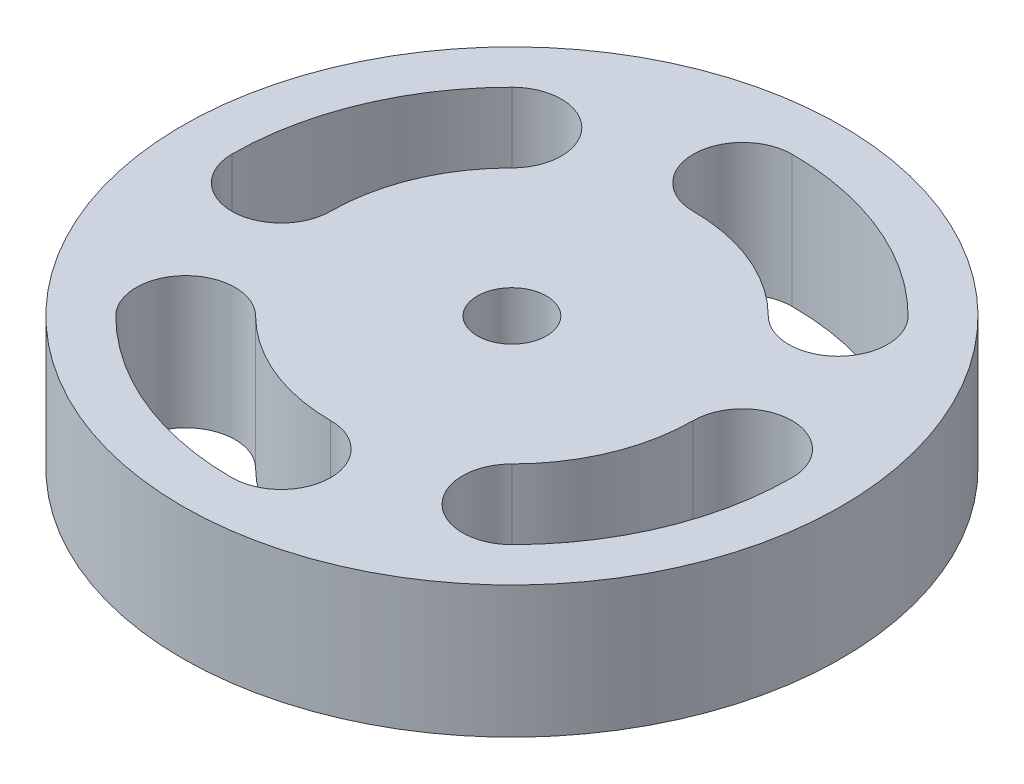
ISO-10303-21;
HEADER;
FILE_DESCRIPTION(('STEP AP214'),'2;1');
FILE_NAME('part.step','',(''),(''),'','','');
FILE_SCHEMA(('AUTOMOTIVE_DESIGN { 1 0 10303 214 1 1 1 1 }'));
ENDSEC;
DATA;
#1=APPLICATION_CONTEXT('core data for automotive mechanical design processes');
#2=APPLICATION_PROTOCOL_DEFINITION('international standard','automotive_design',2000,#1);
#3=PRODUCT_CONTEXT('',#1,'mechanical');
#4=PRODUCT('Part','Part','',(#3));
#5=PRODUCT_RELATED_PRODUCT_CATEGORY('part','',(#4));
#6=PRODUCT_DEFINITION_FORMATION('','',#4);
#7=PRODUCT_DEFINITION_CONTEXT('part definition',#1,'design');
#8=PRODUCT_DEFINITION('design','',#6,#7);
#9=PRODUCT_DEFINITION_SHAPE('','',#8);
#10=(LENGTH_UNIT() NAMED_UNIT(*) SI_UNIT(.MILLI.,.METRE.));
#11=(NAMED_UNIT(*) PLANE_ANGLE_UNIT() SI_UNIT($,.RADIAN.));
#12=(NAMED_UNIT(*) SI_UNIT($,.STERADIAN.) SOLID_ANGLE_UNIT());
#13=UNCERTAINTY_MEASURE_WITH_UNIT(LENGTH_MEASURE(1.E-05),#10,'distance_accuracy_value','');
#14=(GEOMETRIC_REPRESENTATION_CONTEXT(3) GLOBAL_UNCERTAINTY_ASSIGNED_CONTEXT((#13)) GLOBAL_UNIT_ASSIGNED_CONTEXT((#10,
#11,#12)) REPRESENTATION_CONTEXT('',''));
#15=CARTESIAN_POINT('',(0.,0.,0.));
#16=DIRECTION('',(0.,0.,1.));
#17=DIRECTION('',(1.,0.,0.));
#18=AXIS2_PLACEMENT_3D('',#15,#16,#17);
#19=CARTESIAN_POINT('',(0.,20.,0.));
#20=DIRECTION('',(0.,-1.,0.));
#21=DIRECTION('',(0.,0.,-1.));
#22=AXIS2_PLACEMENT_3D('',#19,#20,#21);
#23=CYLINDRICAL_SURFACE('',#22,50.);
#24=CARTESIAN_POINT('',(0.,20.,0.));
#25=DIRECTION('',(0.,1.,0.));
#26=DIRECTION('',(0.,0.,1.));
#27=AXIS2_PLACEMENT_3D('',#24,#25,#26);
#28=CIRCLE('',#27,50.);
#29=CARTESIAN_POINT('',(0.,20.,50.));
#30=VERTEX_POINT('',#29);
#31=EDGE_CURVE('E11',#30,#30,#28,.T.);
#32=ORIENTED_EDGE('',*,*,#31,.F.);
#33=EDGE_LOOP('',(#32));
#34=FACE_BOUND('',#33,.T.);
#35=CARTESIAN_POINT('',(0.,0.,0.));
#36=DIRECTION('',(0.,1.,0.));
#37=DIRECTION('',(0.,0.,1.));
#38=AXIS2_PLACEMENT_3D('',#35,#36,#37);
#39=CIRCLE('',#38,50.);
#40=CARTESIAN_POINT('',(0.,0.,50.));
#41=VERTEX_POINT('',#40);
#42=EDGE_CURVE('E48',#41,#41,#39,.T.);
#43=ORIENTED_EDGE('',*,*,#42,.T.);
#44=EDGE_LOOP('',(#43));
#45=FACE_BOUND('',#44,.T.);
#46=ADVANCED_FACE('F45',(#34,#45),#23,.T.);
#47=CARTESIAN_POINT('',(0.,20.,0.));
#48=DIRECTION('',(0.,1.,0.));
#49=DIRECTION('',(0.,0.,1.));
#50=AXIS2_PLACEMENT_3D('',#47,#48,#49);
#51=PLANE('',#50);
#52=CARTESIAN_POINT('',(0.,20.,-35.));
#53=DIRECTION('',(0.,1.,0.));
#54=DIRECTION('',(0.,0.,1.));
#55=AXIS2_PLACEMENT_3D('',#52,#53,#54);
#56=CIRCLE('',#55,7.5);
#57=CARTESIAN_POINT('',(0.,20.,-42.5));
#58=VERTEX_POINT('',#57);
#59=CARTESIAN_POINT('',(0.,20.,-27.5));
#60=VERTEX_POINT('',#59);
#61=EDGE_CURVE('E60',#58,#60,#56,.T.);
#62=ORIENTED_EDGE('',*,*,#61,.F.);
#63=CARTESIAN_POINT('',(0.,20.,0.));
#64=DIRECTION('',(0.,1.,0.));
#65=DIRECTION('',(0.,0.,1.));
#66=AXIS2_PLACEMENT_3D('',#63,#64,#65);
#67=CIRCLE('',#66,42.5);
#68=CARTESIAN_POINT('',(30.0520382004283,20.,-30.0520382004282));
#69=VERTEX_POINT('',#68);
#70=EDGE_CURVE('E263',#69,#58,#67,.T.);
#71=ORIENTED_EDGE('',*,*,#70,.F.);
#72=CARTESIAN_POINT('',(24.7487373415292,20.,-24.7487373415291));
#73=DIRECTION('',(0.,1.,0.));
#74=DIRECTION('',(0.,0.,1.));
#75=AXIS2_PLACEMENT_3D('',#72,#73,#74);
#76=CIRCLE('',#75,7.5);
#77=CARTESIAN_POINT('',(19.4454364826301,20.,-19.44543648263));
#78=VERTEX_POINT('',#77);
#79=EDGE_CURVE('E281',#78,#69,#76,.T.);
#80=ORIENTED_EDGE('',*,*,#79,.F.);
#81=CARTESIAN_POINT('',(0.,20.,0.));
#82=DIRECTION('',(0.,1.,0.));
#83=DIRECTION('',(0.,0.,1.));
#84=AXIS2_PLACEMENT_3D('',#81,#82,#83);
#85=CIRCLE('',#84,27.5);
#86=EDGE_CURVE('E277',#78,#60,#85,.T.);
#87=ORIENTED_EDGE('',*,*,#86,.T.);
#88=EDGE_LOOP('',(#62,#71,#80,#87));
#89=FACE_BOUND('',#88,.T.);
#90=CARTESIAN_POINT('',(35.,20.,1.2220184685951E-13));
#91=DIRECTION('',(0.,1.,0.));
#92=DIRECTION('',(0.,0.,1.));
#93=AXIS2_PLACEMENT_3D('',#90,#91,#92);
#94=CIRCLE('',#93,7.5);
#95=CARTESIAN_POINT('',(42.5,20.,1.48387956900833E-13));
#96=VERTEX_POINT('',#95);
#97=CARTESIAN_POINT('',(27.5,20.,0.));
#98=VERTEX_POINT('',#97);
#99=EDGE_CURVE('E68',#96,#98,#94,.T.);
#100=ORIENTED_EDGE('',*,*,#99,.F.);
#101=CARTESIAN_POINT('',(0.,20.,0.));
#102=DIRECTION('',(0.,1.,0.));
#103=DIRECTION('',(0.,0.,1.));
#104=AXIS2_PLACEMENT_3D('',#101,#102,#103);
#105=CIRCLE('',#104,42.5);
#106=CARTESIAN_POINT('',(30.0520382004281,20.,30.0520382004284));
#107=VERTEX_POINT('',#106);
#108=EDGE_CURVE('E222',#107,#96,#105,.T.);
#109=ORIENTED_EDGE('',*,*,#108,.F.);
#110=CARTESIAN_POINT('',(24.748737341529,20.,24.7487373415293));
#111=DIRECTION('',(0.,1.,0.));
#112=DIRECTION('',(0.,0.,1.));
#113=AXIS2_PLACEMENT_3D('',#110,#111,#112);
#114=CIRCLE('',#113,7.5);
#115=CARTESIAN_POINT('',(19.44543648263,20.,19.4454364826302));
#116=VERTEX_POINT('',#115);
#117=EDGE_CURVE('E241',#116,#107,#114,.T.);
#118=ORIENTED_EDGE('',*,*,#117,.F.);
#119=CARTESIAN_POINT('',(0.,20.,0.));
#120=DIRECTION('',(0.,1.,0.));
#121=DIRECTION('',(0.,0.,1.));
#122=AXIS2_PLACEMENT_3D('',#119,#120,#121);
#123=CIRCLE('',#122,27.5);
#124=EDGE_CURVE('E236',#116,#98,#123,.T.);
#125=ORIENTED_EDGE('',*,*,#124,.T.);
#126=EDGE_LOOP('',(#100,#109,#118,#125));
#127=FACE_BOUND('',#126,.T.);
#128=CARTESIAN_POINT('',(0.,20.,0.));
#129=DIRECTION('',(0.,1.,0.));
#130=DIRECTION('',(0.,0.,1.));
#131=AXIS2_PLACEMENT_3D('',#128,#129,#130);
#132=CIRCLE('',#131,42.5);
#133=CARTESIAN_POINT('',(-30.0520382004285,20.,30.052038200428));
#134=VERTEX_POINT('',#133);
#135=CARTESIAN_POINT('',(-2.44403693719019E-13,20.,42.5));
#136=VERTEX_POINT('',#135);
#137=EDGE_CURVE('E167',#134,#136,#132,.T.);
#138=ORIENTED_EDGE('',*,*,#137,.F.);
#139=CARTESIAN_POINT('',(-24.7487373415294,20.,24.748737341529));
#140=DIRECTION('',(0.,1.,0.));
#141=DIRECTION('',(0.,0.,1.));
#142=AXIS2_PLACEMENT_3D('',#139,#140,#141);
#143=CIRCLE('',#142,7.5);
#144=CARTESIAN_POINT('',(-19.4454364826302,20.,19.4454364826299));
#145=VERTEX_POINT('',#144);
#146=EDGE_CURVE('E188',#145,#134,#143,.T.);
#147=ORIENTED_EDGE('',*,*,#146,.F.);
#148=CARTESIAN_POINT('',(0.,20.,0.));
#149=DIRECTION('',(0.,1.,0.));
#150=DIRECTION('',(0.,0.,1.));
#151=AXIS2_PLACEMENT_3D('',#148,#149,#150);
#152=CIRCLE('',#151,27.5);
#153=CARTESIAN_POINT('',(-1.92031473636372E-13,20.,27.5));
#154=VERTEX_POINT('',#153);
#155=EDGE_CURVE('E192',#145,#154,#152,.T.);
#156=ORIENTED_EDGE('',*,*,#155,.T.);
#157=CARTESIAN_POINT('',(-2.44403693719019E-13,20.,35.));
#158=DIRECTION('',(0.,1.,0.));
#159=DIRECTION('',(0.,0.,1.));
#160=AXIS2_PLACEMENT_3D('',#157,#158,#159);
#161=CIRCLE('',#160,7.5);
#162=EDGE_CURVE('E201',#136,#154,#161,.T.);
#163=ORIENTED_EDGE('',*,*,#162,.F.);
#164=EDGE_LOOP('',(#138,#147,#156,#163));
#165=FACE_BOUND('',#164,.T.);
#166=CARTESIAN_POINT('',(0.,20.,0.));
#167=DIRECTION('',(0.,1.,0.));
#168=DIRECTION('',(0.,0.,1.));
#169=AXIS2_PLACEMENT_3D('',#166,#167,#168);
#170=CIRCLE('',#169,42.5);
#171=CARTESIAN_POINT('',(-30.0520382004279,20.,-30.0520382004286));
#172=VERTEX_POINT('',#171);
#173=CARTESIAN_POINT('',(-42.5,20.,-4.451638707025E-13));
#174=VERTEX_POINT('',#173);
#175=EDGE_CURVE('E211',#172,#174,#170,.T.);
#176=ORIENTED_EDGE('',*,*,#175,.F.);
#177=CARTESIAN_POINT('',(-24.7487373415289,20.,-24.7487373415295));
#178=DIRECTION('',(0.,1.,0.));
#179=DIRECTION('',(0.,0.,1.));
#180=AXIS2_PLACEMENT_3D('',#177,#178,#179);
#181=CIRCLE('',#180,7.5);
#182=CARTESIAN_POINT('',(-19.4454364826298,20.,-19.4454364826303));
#183=VERTEX_POINT('',#182);
#184=EDGE_CURVE('E303',#183,#172,#181,.T.);
#185=ORIENTED_EDGE('',*,*,#184,.F.);
#186=CARTESIAN_POINT('',(0.,20.,0.));
#187=DIRECTION('',(0.,1.,0.));
#188=DIRECTION('',(0.,0.,1.));
#189=AXIS2_PLACEMENT_3D('',#186,#187,#188);
#190=CIRCLE('',#189,27.5);
#191=CARTESIAN_POINT('',(-27.5,20.,-2.88047210454559E-13));
#192=VERTEX_POINT('',#191);
#193=EDGE_CURVE('E322',#183,#192,#190,.T.);
#194=ORIENTED_EDGE('',*,*,#193,.T.);
#195=CARTESIAN_POINT('',(-35.,20.,-3.66605540578529E-13));
#196=DIRECTION('',(0.,1.,0.));
#197=DIRECTION('',(0.,0.,1.));
#198=AXIS2_PLACEMENT_3D('',#195,#196,#197);
#199=CIRCLE('',#198,7.5);
#200=EDGE_CURVE('E318',#174,#192,#199,.T.);
#201=ORIENTED_EDGE('',*,*,#200,.F.);
#202=EDGE_LOOP('',(#176,#185,#194,#201));
#203=FACE_BOUND('',#202,.T.);
#204=CARTESIAN_POINT('',(0.,20.,0.));
#205=DIRECTION('',(0.,1.,0.));
#206=DIRECTION('',(0.,0.,1.));
#207=AXIS2_PLACEMENT_3D('',#204,#205,#206);
#208=CIRCLE('',#207,5.25);
#209=CARTESIAN_POINT('',(0.,20.,5.25));
#210=VERTEX_POINT('',#209);
#211=EDGE_CURVE('E332',#210,#210,#208,.T.);
#212=ORIENTED_EDGE('',*,*,#211,.F.);
#213=EDGE_LOOP('',(#212));
#214=FACE_BOUND('',#213,.T.);
#215=ORIENTED_EDGE('',*,*,#31,.T.);
#216=EDGE_LOOP('',(#215));
#217=FACE_BOUND('',#216,.T.);
#218=ADVANCED_FACE('F352',(#89,#127,#165,#203,#214,#217),#51,.T.);
#219=CARTESIAN_POINT('',(0.,0.,0.));
#220=DIRECTION('',(0.,1.,0.));
#221=DIRECTION('',(0.,0.,1.));
#222=AXIS2_PLACEMENT_3D('',#219,#220,#221);
#223=PLANE('',#222);
#224=CARTESIAN_POINT('',(0.,0.,0.));
#225=DIRECTION('',(0.,1.,0.));
#226=DIRECTION('',(0.,0.,1.));
#227=AXIS2_PLACEMENT_3D('',#224,#225,#226);
#228=CIRCLE('',#227,42.5);
#229=CARTESIAN_POINT('',(30.0520382004283,0.,-30.0520382004282));
#230=VERTEX_POINT('',#229);
#231=CARTESIAN_POINT('',(0.,0.,-42.5));
#232=VERTEX_POINT('',#231);
#233=EDGE_CURVE('E270',#230,#232,#228,.T.);
#234=ORIENTED_EDGE('',*,*,#233,.T.);
#235=CARTESIAN_POINT('',(0.,0.,-35.));
#236=DIRECTION('',(0.,1.,0.));
#237=DIRECTION('',(0.,0.,1.));
#238=AXIS2_PLACEMENT_3D('',#235,#236,#237);
#239=CIRCLE('',#238,7.5);
#240=CARTESIAN_POINT('',(0.,0.,-27.5));
#241=VERTEX_POINT('',#240);
#242=EDGE_CURVE('E258',#232,#241,#239,.T.);
#243=ORIENTED_EDGE('',*,*,#242,.T.);
#244=CARTESIAN_POINT('',(0.,0.,0.));
#245=DIRECTION('',(0.,1.,0.));
#246=DIRECTION('',(0.,0.,1.));
#247=AXIS2_PLACEMENT_3D('',#244,#245,#246);
#248=CIRCLE('',#247,27.5);
#249=CARTESIAN_POINT('',(19.4454364826301,0.,-19.44543648263));
#250=VERTEX_POINT('',#249);
#251=EDGE_CURVE('E262',#250,#241,#248,.T.);
#252=ORIENTED_EDGE('',*,*,#251,.F.);
#253=CARTESIAN_POINT('',(24.7487373415292,0.,-24.7487373415291));
#254=DIRECTION('',(0.,1.,0.));
#255=DIRECTION('',(0.,0.,1.));
#256=AXIS2_PLACEMENT_3D('',#253,#254,#255);
#257=CIRCLE('',#256,7.5);
#258=EDGE_CURVE('E266',#250,#230,#257,.T.);
#259=ORIENTED_EDGE('',*,*,#258,.T.);
#260=EDGE_LOOP('',(#234,#243,#252,#259));
#261=FACE_BOUND('',#260,.T.);
#262=CARTESIAN_POINT('',(0.,0.,0.));
#263=DIRECTION('',(0.,1.,0.));
#264=DIRECTION('',(0.,0.,1.));
#265=AXIS2_PLACEMENT_3D('',#262,#263,#264);
#266=CIRCLE('',#265,42.5);
#267=CARTESIAN_POINT('',(30.0520382004281,0.,30.0520382004284));
#268=VERTEX_POINT('',#267);
#269=CARTESIAN_POINT('',(42.5,0.,1.48387956900833E-13));
#270=VERTEX_POINT('',#269);
#271=EDGE_CURVE('E229',#268,#270,#266,.T.);
#272=ORIENTED_EDGE('',*,*,#271,.T.);
#273=CARTESIAN_POINT('',(35.,0.,1.2220184685951E-13));
#274=DIRECTION('',(0.,1.,0.));
#275=DIRECTION('',(0.,0.,1.));
#276=AXIS2_PLACEMENT_3D('',#273,#274,#275);
#277=CIRCLE('',#276,7.5);
#278=CARTESIAN_POINT('',(27.5,0.,0.));
#279=VERTEX_POINT('',#278);
#280=EDGE_CURVE('E217',#270,#279,#277,.T.);
#281=ORIENTED_EDGE('',*,*,#280,.T.);
#282=CARTESIAN_POINT('',(0.,0.,0.));
#283=DIRECTION('',(0.,1.,0.));
#284=DIRECTION('',(0.,0.,1.));
#285=AXIS2_PLACEMENT_3D('',#282,#283,#284);
#286=CIRCLE('',#285,27.5);
#287=CARTESIAN_POINT('',(19.44543648263,0.,19.4454364826302));
#288=VERTEX_POINT('',#287);
#289=EDGE_CURVE('E221',#288,#279,#286,.T.);
#290=ORIENTED_EDGE('',*,*,#289,.F.);
#291=CARTESIAN_POINT('',(24.748737341529,0.,24.7487373415293));
#292=DIRECTION('',(0.,1.,0.));
#293=DIRECTION('',(0.,0.,1.));
#294=AXIS2_PLACEMENT_3D('',#291,#292,#293);
#295=CIRCLE('',#294,7.5);
#296=EDGE_CURVE('E225',#288,#268,#295,.T.);
#297=ORIENTED_EDGE('',*,*,#296,.T.);
#298=EDGE_LOOP('',(#272,#281,#290,#297));
#299=FACE_BOUND('',#298,.T.);
#300=CARTESIAN_POINT('',(-24.7487373415294,0.,24.748737341529));
#301=DIRECTION('',(0.,1.,0.));
#302=DIRECTION('',(0.,0.,1.));
#303=AXIS2_PLACEMENT_3D('',#300,#301,#302);
#304=CIRCLE('',#303,7.5);
#305=CARTESIAN_POINT('',(-19.4454364826302,0.,19.4454364826299));
#306=VERTEX_POINT('',#305);
#307=CARTESIAN_POINT('',(-30.0520382004285,0.,30.052038200428));
#308=VERTEX_POINT('',#307);
#309=EDGE_CURVE('E173',#306,#308,#304,.T.);
#310=ORIENTED_EDGE('',*,*,#309,.T.);
#311=CARTESIAN_POINT('',(0.,0.,0.));
#312=DIRECTION('',(0.,1.,0.));
#313=DIRECTION('',(0.,0.,1.));
#314=AXIS2_PLACEMENT_3D('',#311,#312,#313);
#315=CIRCLE('',#314,42.5);
#316=CARTESIAN_POINT('',(-2.96775913801666E-13,0.,42.5));
#317=VERTEX_POINT('',#316);
#318=EDGE_CURVE('E164',#308,#317,#315,.T.);
#319=ORIENTED_EDGE('',*,*,#318,.T.);
#320=CARTESIAN_POINT('',(-2.44403693719019E-13,0.,35.));
#321=DIRECTION('',(0.,1.,0.));
#322=DIRECTION('',(0.,0.,1.));
#323=AXIS2_PLACEMENT_3D('',#320,#321,#322);
#324=CIRCLE('',#323,7.5);
#325=CARTESIAN_POINT('',(-1.92031473636372E-13,0.,27.5));
#326=VERTEX_POINT('',#325);
#327=EDGE_CURVE('E176',#317,#326,#324,.T.);
#328=ORIENTED_EDGE('',*,*,#327,.T.);
#329=CARTESIAN_POINT('',(0.,0.,0.));
#330=DIRECTION('',(0.,1.,0.));
#331=DIRECTION('',(0.,0.,1.));
#332=AXIS2_PLACEMENT_3D('',#329,#330,#331);
#333=CIRCLE('',#332,27.5);
#334=EDGE_CURVE('E182',#306,#326,#333,.T.);
#335=ORIENTED_EDGE('',*,*,#334,.F.);
#336=EDGE_LOOP('',(#310,#319,#328,#335));
#337=FACE_BOUND('',#336,.T.);
#338=CARTESIAN_POINT('',(-24.7487373415289,0.,-24.7487373415295));
#339=DIRECTION('',(0.,1.,0.));
#340=DIRECTION('',(0.,0.,1.));
#341=AXIS2_PLACEMENT_3D('',#338,#339,#340);
#342=CIRCLE('',#341,7.5);
#343=CARTESIAN_POINT('',(-19.4454364826298,0.,-19.4454364826303));
#344=VERTEX_POINT('',#343);
#345=CARTESIAN_POINT('',(-30.0520382004279,0.,-30.0520382004286));
#346=VERTEX_POINT('',#345);
#347=EDGE_CURVE('E311',#344,#346,#342,.T.);
#348=ORIENTED_EDGE('',*,*,#347,.T.);
#349=CARTESIAN_POINT('',(0.,0.,0.));
#350=DIRECTION('',(0.,1.,0.));
#351=DIRECTION('',(0.,0.,1.));
#352=AXIS2_PLACEMENT_3D('',#349,#350,#351);
#353=CIRCLE('',#352,42.5);
#354=CARTESIAN_POINT('',(-42.5,0.,-4.451638707025E-13));
#355=VERTEX_POINT('',#354);
#356=EDGE_CURVE('E298',#346,#355,#353,.T.);
#357=ORIENTED_EDGE('',*,*,#356,.T.);
#358=CARTESIAN_POINT('',(-35.,0.,-3.66605540578529E-13));
#359=DIRECTION('',(0.,1.,0.));
#360=DIRECTION('',(0.,0.,1.));
#361=AXIS2_PLACEMENT_3D('',#358,#359,#360);
#362=CIRCLE('',#361,7.5);
#363=CARTESIAN_POINT('',(-27.5,0.,-2.88047210454559E-13));
#364=VERTEX_POINT('',#363);
#365=EDGE_CURVE('E302',#355,#364,#362,.T.);
#366=ORIENTED_EDGE('',*,*,#365,.T.);
#367=CARTESIAN_POINT('',(0.,0.,0.));
#368=DIRECTION('',(0.,1.,0.));
#369=DIRECTION('',(0.,0.,1.));
#370=AXIS2_PLACEMENT_3D('',#367,#368,#369);
#371=CIRCLE('',#370,27.5);
#372=EDGE_CURVE('E307',#344,#364,#371,.T.);
#373=ORIENTED_EDGE('',*,*,#372,.F.);
#374=EDGE_LOOP('',(#348,#357,#366,#373));
#375=FACE_BOUND('',#374,.T.);
#376=CARTESIAN_POINT('',(0.,0.,0.));
#377=DIRECTION('',(0.,1.,0.));
#378=DIRECTION('',(0.,0.,1.));
#379=AXIS2_PLACEMENT_3D('',#376,#377,#378);
#380=CIRCLE('',#379,5.25);
#381=CARTESIAN_POINT('',(0.,0.,5.25));
#382=VERTEX_POINT('',#381);
#383=EDGE_CURVE('E342',#382,#382,#380,.T.);
#384=ORIENTED_EDGE('',*,*,#383,.T.);
#385=EDGE_LOOP('',(#384));
#386=FACE_BOUND('',#385,.T.);
#387=ORIENTED_EDGE('',*,*,#42,.F.);
#388=EDGE_LOOP('',(#387));
#389=FACE_BOUND('',#388,.T.);
#390=ADVANCED_FACE('F184',(#261,#299,#337,#375,#386,#389),#223,.F.);
#391=CARTESIAN_POINT('',(0.,0.,0.));
#392=DIRECTION('',(0.,1.,0.));
#393=DIRECTION('',(0.,0.,1.));
#394=AXIS2_PLACEMENT_3D('',#391,#392,#393);
#395=CYLINDRICAL_SURFACE('',#394,5.25);
#396=ORIENTED_EDGE('',*,*,#383,.F.);
#397=EDGE_LOOP('',(#396));
#398=FACE_BOUND('',#397,.T.);
#399=ORIENTED_EDGE('',*,*,#211,.T.);
#400=EDGE_LOOP('',(#399));
#401=FACE_BOUND('',#400,.T.);
#402=ADVANCED_FACE('F350',(#398,#401),#395,.F.);
#403=CARTESIAN_POINT('',(0.,0.,0.));
#404=DIRECTION('',(0.,1.,0.));
#405=DIRECTION('',(0.,0.,1.));
#406=AXIS2_PLACEMENT_3D('',#403,#404,#405);
#407=CYLINDRICAL_SURFACE('',#406,42.5);
#408=ORIENTED_EDGE('',*,*,#175,.T.);
#409=DIRECTION('',(0.,1.,0.));
#410=VECTOR('',#409,1.);
#411=CARTESIAN_POINT('',(-42.5,0.,-4.451638707025E-13));
#412=LINE('',#411,#410);
#413=EDGE_CURVE('E315',#355,#174,#412,.T.);
#414=ORIENTED_EDGE('',*,*,#413,.F.);
#415=ORIENTED_EDGE('',*,*,#356,.F.);
#416=DIRECTION('',(0.,1.,0.));
#417=VECTOR('',#416,1.);
#418=CARTESIAN_POINT('',(-30.0520382004279,0.,-30.0520382004286));
#419=LINE('',#418,#417);
#420=EDGE_CURVE('E329',#346,#172,#419,.T.);
#421=ORIENTED_EDGE('',*,*,#420,.T.);
#422=EDGE_LOOP('',(#408,#414,#415,#421));
#423=FACE_BOUND('',#422,.T.);
#424=ADVANCED_FACE('F371',(#423),#407,.F.);
#425=CARTESIAN_POINT('',(-24.7487373415289,0.,-24.7487373415295));
#426=DIRECTION('',(0.,1.,0.));
#427=DIRECTION('',(0.,0.,1.));
#428=AXIS2_PLACEMENT_3D('',#425,#426,#427);
#429=CYLINDRICAL_SURFACE('',#428,7.5);
#430=ORIENTED_EDGE('',*,*,#184,.T.);
#431=ORIENTED_EDGE('',*,*,#420,.F.);
#432=ORIENTED_EDGE('',*,*,#347,.F.);
#433=DIRECTION('',(0.,1.,0.));
#434=VECTOR('',#433,1.);
#435=CARTESIAN_POINT('',(-19.4454364826298,0.,-19.4454364826303));
#436=LINE('',#435,#434);
#437=EDGE_CURVE('E333',#344,#183,#436,.T.);
#438=ORIENTED_EDGE('',*,*,#437,.T.);
#439=EDGE_LOOP('',(#430,#431,#432,#438));
#440=FACE_BOUND('',#439,.T.);
#441=ADVANCED_FACE('F377',(#440),#429,.F.);
#442=CARTESIAN_POINT('',(0.,0.,0.));
#443=DIRECTION('',(0.,1.,0.));
#444=DIRECTION('',(0.,0.,1.));
#445=AXIS2_PLACEMENT_3D('',#442,#443,#444);
#446=CYLINDRICAL_SURFACE('',#445,27.5);
#447=ORIENTED_EDGE('',*,*,#193,.F.);
#448=ORIENTED_EDGE('',*,*,#437,.F.);
#449=ORIENTED_EDGE('',*,*,#372,.T.);
#450=DIRECTION('',(0.,1.,0.));
#451=VECTOR('',#450,1.);
#452=CARTESIAN_POINT('',(-27.5,0.,-2.88047210454559E-13));
#453=LINE('',#452,#451);
#454=EDGE_CURVE('E336',#364,#192,#453,.T.);
#455=ORIENTED_EDGE('',*,*,#454,.T.);
#456=EDGE_LOOP('',(#447,#448,#449,#455));
#457=FACE_BOUND('',#456,.T.);
#458=ADVANCED_FACE('F382',(#457),#446,.T.);
#459=CARTESIAN_POINT('',(-35.,0.,-3.66605540578529E-13));
#460=DIRECTION('',(0.,1.,0.));
#461=DIRECTION('',(0.,0.,1.));
#462=AXIS2_PLACEMENT_3D('',#459,#460,#461);
#463=CYLINDRICAL_SURFACE('',#462,7.5);
#464=ORIENTED_EDGE('',*,*,#200,.T.);
#465=ORIENTED_EDGE('',*,*,#454,.F.);
#466=ORIENTED_EDGE('',*,*,#365,.F.);
#467=ORIENTED_EDGE('',*,*,#413,.T.);
#468=EDGE_LOOP('',(#464,#465,#466,#467));
#469=FACE_BOUND('',#468,.T.);
#470=ADVANCED_FACE('F379',(#469),#463,.F.);
#471=CARTESIAN_POINT('',(0.,0.,0.));
#472=DIRECTION('',(0.,1.,0.));
#473=DIRECTION('',(0.,0.,1.));
#474=AXIS2_PLACEMENT_3D('',#471,#472,#473);
#475=CYLINDRICAL_SURFACE('',#474,42.5);
#476=ORIENTED_EDGE('',*,*,#137,.T.);
#477=DIRECTION('',(0.,1.,0.));
#478=VECTOR('',#477,1.);
#479=CARTESIAN_POINT('',(-2.96775913801666E-13,0.,42.5));
#480=LINE('',#479,#478);
#481=EDGE_CURVE('E160',#317,#136,#480,.T.);
#482=ORIENTED_EDGE('',*,*,#481,.F.);
#483=ORIENTED_EDGE('',*,*,#318,.F.);
#484=DIRECTION('',(0.,1.,0.));
#485=VECTOR('',#484,1.);
#486=CARTESIAN_POINT('',(-30.0520382004285,0.,30.052038200428));
#487=LINE('',#486,#485);
#488=EDGE_CURVE('E208',#308,#134,#487,.T.);
#489=ORIENTED_EDGE('',*,*,#488,.T.);
#490=EDGE_LOOP('',(#476,#482,#483,#489));
#491=FACE_BOUND('',#490,.T.);
#492=ADVANCED_FACE('F162',(#491),#475,.F.);
#493=CARTESIAN_POINT('',(-24.7487373415294,0.,24.748737341529));
#494=DIRECTION('',(0.,1.,0.));
#495=DIRECTION('',(0.,0.,1.));
#496=AXIS2_PLACEMENT_3D('',#493,#494,#495);
#497=CYLINDRICAL_SURFACE('',#496,7.5);
#498=ORIENTED_EDGE('',*,*,#146,.T.);
#499=ORIENTED_EDGE('',*,*,#488,.F.);
#500=ORIENTED_EDGE('',*,*,#309,.F.);
#501=DIRECTION('',(0.,1.,0.));
#502=VECTOR('',#501,1.);
#503=CARTESIAN_POINT('',(-19.4454364826302,0.,19.4454364826299));
#504=LINE('',#503,#502);
#505=EDGE_CURVE('E212',#306,#145,#504,.T.);
#506=ORIENTED_EDGE('',*,*,#505,.T.);
#507=EDGE_LOOP('',(#498,#499,#500,#506));
#508=FACE_BOUND('',#507,.T.);
#509=ADVANCED_FACE('F422',(#508),#497,.F.);
#510=CARTESIAN_POINT('',(0.,0.,0.));
#511=DIRECTION('',(0.,1.,0.));
#512=DIRECTION('',(0.,0.,1.));
#513=AXIS2_PLACEMENT_3D('',#510,#511,#512);
#514=CYLINDRICAL_SURFACE('',#513,27.5);
#515=ORIENTED_EDGE('',*,*,#155,.F.);
#516=ORIENTED_EDGE('',*,*,#505,.F.);
#517=ORIENTED_EDGE('',*,*,#334,.T.);
#518=DIRECTION('',(0.,1.,0.));
#519=VECTOR('',#518,1.);
#520=CARTESIAN_POINT('',(-1.92031473636372E-13,0.,27.5));
#521=LINE('',#520,#519);
#522=EDGE_CURVE('E172',#326,#154,#521,.T.);
#523=ORIENTED_EDGE('',*,*,#522,.T.);
#524=EDGE_LOOP('',(#515,#516,#517,#523));
#525=FACE_BOUND('',#524,.T.);
#526=ADVANCED_FACE('F425',(#525),#514,.T.);
#527=CARTESIAN_POINT('',(-2.44403693719019E-13,0.,35.));
#528=DIRECTION('',(0.,1.,0.));
#529=DIRECTION('',(0.,0.,1.));
#530=AXIS2_PLACEMENT_3D('',#527,#528,#529);
#531=CYLINDRICAL_SURFACE('',#530,7.5);
#532=ORIENTED_EDGE('',*,*,#162,.T.);
#533=ORIENTED_EDGE('',*,*,#522,.F.);
#534=ORIENTED_EDGE('',*,*,#327,.F.);
#535=ORIENTED_EDGE('',*,*,#481,.T.);
#536=EDGE_LOOP('',(#532,#533,#534,#535));
#537=FACE_BOUND('',#536,.T.);
#538=ADVANCED_FACE('F177',(#537),#531,.F.);
#539=CARTESIAN_POINT('',(35.,0.,1.2220184685951E-13));
#540=DIRECTION('',(0.,1.,0.));
#541=DIRECTION('',(0.,0.,1.));
#542=AXIS2_PLACEMENT_3D('',#539,#540,#541);
#543=CYLINDRICAL_SURFACE('',#542,7.5);
#544=ORIENTED_EDGE('',*,*,#99,.T.);
#545=DIRECTION('',(0.,1.,0.));
#546=VECTOR('',#545,1.);
#547=CARTESIAN_POINT('',(27.5,0.,0.));
#548=LINE('',#547,#546);
#549=EDGE_CURVE('E233',#279,#98,#548,.T.);
#550=ORIENTED_EDGE('',*,*,#549,.F.);
#551=ORIENTED_EDGE('',*,*,#280,.F.);
#552=DIRECTION('',(0.,1.,0.));
#553=VECTOR('',#552,1.);
#554=CARTESIAN_POINT('',(42.5,0.,1.48387956900833E-13));
#555=LINE('',#554,#553);
#556=EDGE_CURVE('E202',#270,#96,#555,.T.);
#557=ORIENTED_EDGE('',*,*,#556,.T.);
#558=EDGE_LOOP('',(#544,#550,#551,#557));
#559=FACE_BOUND('',#558,.T.);
#560=ADVANCED_FACE('F406',(#559),#543,.F.);
#561=CARTESIAN_POINT('',(0.,0.,0.));
#562=DIRECTION('',(0.,1.,0.));
#563=DIRECTION('',(0.,0.,1.));
#564=AXIS2_PLACEMENT_3D('',#561,#562,#563);
#565=CYLINDRICAL_SURFACE('',#564,42.5);
#566=ORIENTED_EDGE('',*,*,#108,.T.);
#567=ORIENTED_EDGE('',*,*,#556,.F.);
#568=ORIENTED_EDGE('',*,*,#271,.F.);
#569=DIRECTION('',(0.,1.,0.));
#570=VECTOR('',#569,1.);
#571=CARTESIAN_POINT('',(30.0520382004281,0.,30.0520382004284));
#572=LINE('',#571,#570);
#573=EDGE_CURVE('E250',#268,#107,#572,.T.);
#574=ORIENTED_EDGE('',*,*,#573,.T.);
#575=EDGE_LOOP('',(#566,#567,#568,#574));
#576=FACE_BOUND('',#575,.T.);
#577=ADVANCED_FACE('F409',(#576),#565,.F.);
#578=CARTESIAN_POINT('',(24.748737341529,0.,24.7487373415293));
#579=DIRECTION('',(0.,1.,0.));
#580=DIRECTION('',(0.,0.,1.));
#581=AXIS2_PLACEMENT_3D('',#578,#579,#580);
#582=CYLINDRICAL_SURFACE('',#581,7.5);
#583=ORIENTED_EDGE('',*,*,#117,.T.);
#584=ORIENTED_EDGE('',*,*,#573,.F.);
#585=ORIENTED_EDGE('',*,*,#296,.F.);
#586=DIRECTION('',(0.,1.,0.));
#587=VECTOR('',#586,1.);
#588=CARTESIAN_POINT('',(19.44543648263,0.,19.4454364826302));
#589=LINE('',#588,#587);
#590=EDGE_CURVE('E253',#288,#116,#589,.T.);
#591=ORIENTED_EDGE('',*,*,#590,.T.);
#592=EDGE_LOOP('',(#583,#584,#585,#591));
#593=FACE_BOUND('',#592,.T.);
#594=ADVANCED_FACE('F412',(#593),#582,.F.);
#595=CARTESIAN_POINT('',(0.,0.,0.));
#596=DIRECTION('',(0.,1.,0.));
#597=DIRECTION('',(0.,0.,1.));
#598=AXIS2_PLACEMENT_3D('',#595,#596,#597);
#599=CYLINDRICAL_SURFACE('',#598,27.5);
#600=ORIENTED_EDGE('',*,*,#124,.F.);
#601=ORIENTED_EDGE('',*,*,#590,.F.);
#602=ORIENTED_EDGE('',*,*,#289,.T.);
#603=ORIENTED_EDGE('',*,*,#549,.T.);
#604=EDGE_LOOP('',(#600,#601,#602,#603));
#605=FACE_BOUND('',#604,.T.);
#606=ADVANCED_FACE('F394',(#605),#599,.T.);
#607=CARTESIAN_POINT('',(0.,0.,-35.));
#608=DIRECTION('',(0.,1.,0.));
#609=DIRECTION('',(0.,0.,1.));
#610=AXIS2_PLACEMENT_3D('',#607,#608,#609);
#611=CYLINDRICAL_SURFACE('',#610,7.5);
#612=ORIENTED_EDGE('',*,*,#61,.T.);
#613=DIRECTION('',(0.,1.,0.));
#614=VECTOR('',#613,1.);
#615=CARTESIAN_POINT('',(0.,0.,-27.5));
#616=LINE('',#615,#614);
#617=EDGE_CURVE('E274',#241,#60,#616,.T.);
#618=ORIENTED_EDGE('',*,*,#617,.F.);
#619=ORIENTED_EDGE('',*,*,#242,.F.);
#620=DIRECTION('',(0.,1.,0.));
#621=VECTOR('',#620,1.);
#622=CARTESIAN_POINT('',(0.,0.,-42.5));
#623=LINE('',#622,#621);
#624=EDGE_CURVE('E237',#232,#58,#623,.T.);
#625=ORIENTED_EDGE('',*,*,#624,.T.);
#626=EDGE_LOOP('',(#612,#618,#619,#625));
#627=FACE_BOUND('',#626,.T.);
#628=ADVANCED_FACE('F390',(#627),#611,.F.);
#629=CARTESIAN_POINT('',(0.,0.,0.));
#630=DIRECTION('',(0.,1.,0.));
#631=DIRECTION('',(0.,0.,1.));
#632=AXIS2_PLACEMENT_3D('',#629,#630,#631);
#633=CYLINDRICAL_SURFACE('',#632,42.5);
#634=ORIENTED_EDGE('',*,*,#70,.T.);
#635=ORIENTED_EDGE('',*,*,#624,.F.);
#636=ORIENTED_EDGE('',*,*,#233,.F.);
#637=DIRECTION('',(0.,1.,0.));
#638=VECTOR('',#637,1.);
#639=CARTESIAN_POINT('',(30.0520382004283,0.,-30.0520382004282));
#640=LINE('',#639,#638);
#641=EDGE_CURVE('E290',#230,#69,#640,.T.);
#642=ORIENTED_EDGE('',*,*,#641,.T.);
#643=EDGE_LOOP('',(#634,#635,#636,#642));
#644=FACE_BOUND('',#643,.T.);
#645=ADVANCED_FACE('F393',(#644),#633,.F.);
#646=CARTESIAN_POINT('',(24.7487373415292,0.,-24.7487373415291));
#647=DIRECTION('',(0.,1.,0.));
#648=DIRECTION('',(0.,0.,1.));
#649=AXIS2_PLACEMENT_3D('',#646,#647,#648);
#650=CYLINDRICAL_SURFACE('',#649,7.5);
#651=ORIENTED_EDGE('',*,*,#79,.T.);
#652=ORIENTED_EDGE('',*,*,#641,.F.);
#653=ORIENTED_EDGE('',*,*,#258,.F.);
#654=DIRECTION('',(0.,1.,0.));
#655=VECTOR('',#654,1.);
#656=CARTESIAN_POINT('',(19.4454364826301,0.,-19.44543648263));
#657=LINE('',#656,#655);
#658=EDGE_CURVE('E293',#250,#78,#657,.T.);
#659=ORIENTED_EDGE('',*,*,#658,.T.);
#660=EDGE_LOOP('',(#651,#652,#653,#659));
#661=FACE_BOUND('',#660,.T.);
#662=ADVANCED_FACE('F398',(#661),#650,.F.);
#663=CARTESIAN_POINT('',(0.,0.,0.));
#664=DIRECTION('',(0.,1.,0.));
#665=DIRECTION('',(0.,0.,1.));
#666=AXIS2_PLACEMENT_3D('',#663,#664,#665);
#667=CYLINDRICAL_SURFACE('',#666,27.5);
#668=ORIENTED_EDGE('',*,*,#86,.F.);
#669=ORIENTED_EDGE('',*,*,#658,.F.);
#670=ORIENTED_EDGE('',*,*,#251,.T.);
#671=ORIENTED_EDGE('',*,*,#617,.T.);
#672=EDGE_LOOP('',(#668,#669,#670,#671));
#673=FACE_BOUND('',#672,.T.);
#674=ADVANCED_FACE('F395',(#673),#667,.T.);
#675=CLOSED_SHELL('',(#46,#218,#390,#402,#424,#441,#458,#470,#492,#509,#526,#538,#560,#577,#594,
#606,#628,#645,#662,#674));
#676=MANIFOLD_SOLID_BREP('B2',#675);
#677=ADVANCED_BREP_SHAPE_REPRESENTATION('',(#18,#676),#14);
#678=SHAPE_DEFINITION_REPRESENTATION(#9,#677);
ENDSEC;
END-ISO-10303-21;
